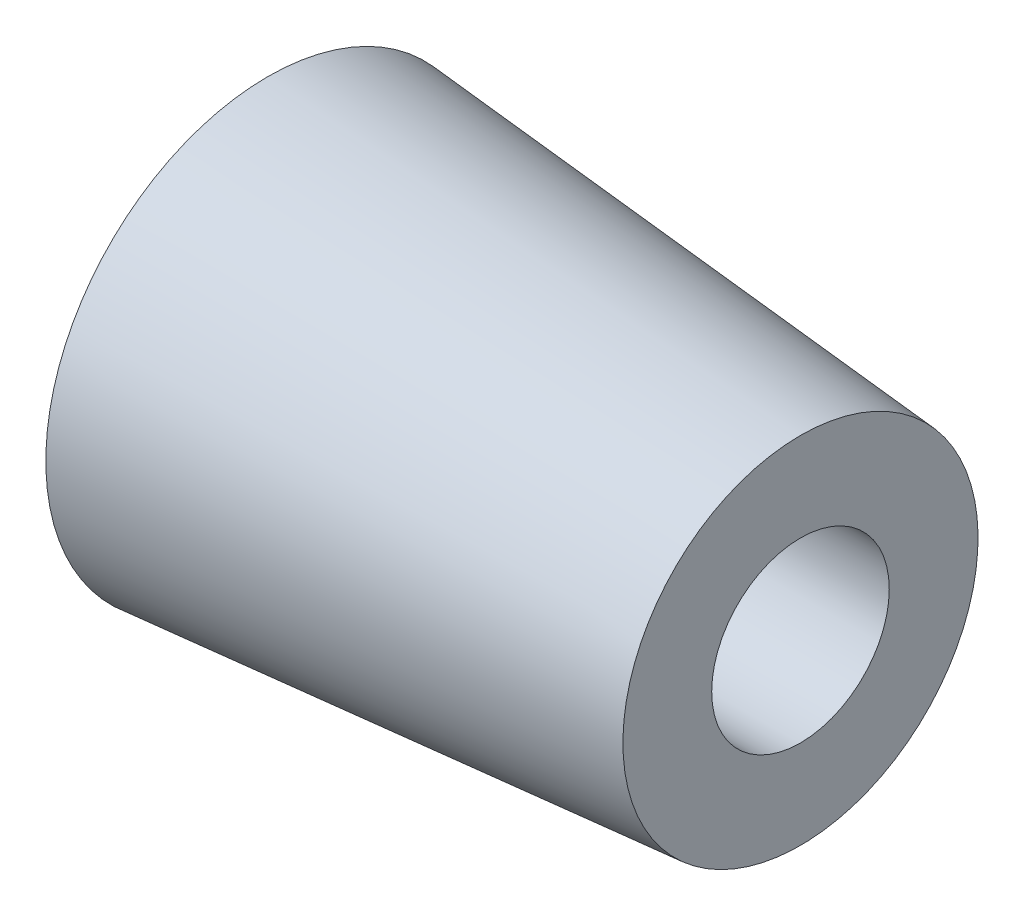
ISO-10303-21;
HEADER;
FILE_DESCRIPTION(('STEP AP214'),'2;1');
FILE_NAME('part.step','',(''),(''),'','','');
FILE_SCHEMA(('AUTOMOTIVE_DESIGN { 1 0 10303 214 1 1 1 1 }'));
ENDSEC;
DATA;
#1=APPLICATION_CONTEXT('core data for automotive mechanical design processes');
#2=APPLICATION_PROTOCOL_DEFINITION('international standard','automotive_design',2000,#1);
#3=PRODUCT_CONTEXT('',#1,'mechanical');
#4=PRODUCT('Part','Part','',(#3));
#5=PRODUCT_RELATED_PRODUCT_CATEGORY('part','',(#4));
#6=PRODUCT_DEFINITION_FORMATION('','',#4);
#7=PRODUCT_DEFINITION_CONTEXT('part definition',#1,'design');
#8=PRODUCT_DEFINITION('design','',#6,#7);
#9=PRODUCT_DEFINITION_SHAPE('','',#8);
#10=(LENGTH_UNIT() NAMED_UNIT(*) SI_UNIT(.MILLI.,.METRE.));
#11=(NAMED_UNIT(*) PLANE_ANGLE_UNIT() SI_UNIT($,.RADIAN.));
#12=(NAMED_UNIT(*) SI_UNIT($,.STERADIAN.) SOLID_ANGLE_UNIT());
#13=UNCERTAINTY_MEASURE_WITH_UNIT(LENGTH_MEASURE(1.E-05),#10,'distance_accuracy_value','');
#14=(GEOMETRIC_REPRESENTATION_CONTEXT(3) GLOBAL_UNCERTAINTY_ASSIGNED_CONTEXT((#13)) GLOBAL_UNIT_ASSIGNED_CONTEXT((#10,
#11,#12)) REPRESENTATION_CONTEXT('',''));
#15=CARTESIAN_POINT('',(0.,0.,0.));
#16=DIRECTION('',(0.,0.,1.));
#17=DIRECTION('',(1.,0.,0.));
#18=AXIS2_PLACEMENT_3D('',#15,#16,#17);
#19=CARTESIAN_POINT('',(0.,0.,0.));
#20=DIRECTION('',(-1.,0.,0.));
#21=DIRECTION('',(0.,-1.,0.));
#22=AXIS2_PLACEMENT_3D('',#19,#20,#21);
#23=PLANE('',#22);
#24=CARTESIAN_POINT('',(0.,0.,0.));
#25=DIRECTION('',(1.,0.,0.));
#26=DIRECTION('',(0.,1.,0.));
#27=AXIS2_PLACEMENT_3D('',#24,#25,#26);
#28=CIRCLE('',#27,2.5);
#29=CARTESIAN_POINT('',(0.,2.5,0.));
#30=VERTEX_POINT('',#29);
#31=EDGE_CURVE('E10',#30,#30,#28,.T.);
#32=ORIENTED_EDGE('',*,*,#31,.F.);
#33=EDGE_LOOP('',(#32));
#34=FACE_BOUND('',#33,.T.);
#35=ADVANCED_FACE('F45',(#34),#23,.T.);
#36=CARTESIAN_POINT('',(6.,0.,0.));
#37=DIRECTION('',(-1.,0.,0.));
#38=DIRECTION('',(0.,-1.,0.));
#39=AXIS2_PLACEMENT_3D('',#36,#37,#38);
#40=CONICAL_SURFACE('',#39,2.,0.0831412318884413);
#41=CARTESIAN_POINT('',(3.6302900335572,-2.17153988797834,-0.336622252254455));
#42=CARTESIAN_POINT('',(3.61171065066113,-2.17626973442894,-0.316215812742302));
#43=CARTESIAN_POINT('',(3.59479454855834,-2.18080062507857,-0.294237309248903));
#44=CARTESIAN_POINT('',(3.5647701473004,-2.18909587381054,-0.247674583678531));
#45=CARTESIAN_POINT('',(3.55166315369669,-2.19285996894597,-0.223089472131822));
#46=CARTESIAN_POINT('',(3.52965911294133,-2.1993031566819,-0.17191840494048));
#47=CARTESIAN_POINT('',(3.52076842738779,-2.20198060887502,-0.145329495551892));
#48=CARTESIAN_POINT('',(3.50754567859207,-2.20599865159785,-0.0909468756274262));
#49=CARTESIAN_POINT('',(3.50321234932978,-2.20733961339522,-0.0631535019232044));
#50=CARTESIAN_POINT('',(3.49932216536154,-2.20854265289097,-0.00800293674296432));
#51=CARTESIAN_POINT('',(3.49963241636339,-2.20844587768327,0.0193440385318699));
#52=CARTESIAN_POINT('',(3.50469456354052,-2.20688244526651,0.0735819376977942));
#53=CARTESIAN_POINT('',(3.50944626548095,-2.20541584796291,0.10047288147983));
#54=CARTESIAN_POINT('',(3.52313995419893,-2.20126704799438,0.152727967793756));
#55=CARTESIAN_POINT('',(3.53203291923467,-2.1985990783317,0.178106155468011));
#56=CARTESIAN_POINT('',(3.55370256708303,-2.19227375599341,0.227011604086022));
#57=CARTESIAN_POINT('',(3.56647979333308,-2.18861626488417,0.250538605454682));
#58=CARTESIAN_POINT('',(3.59598491326627,-2.18047985294387,0.295845207591588));
#59=CARTESIAN_POINT('',(3.61281980105108,-2.17597958595783,0.317551238248277));
#60=CARTESIAN_POINT('',(3.64975849906356,-2.16659191087582,0.35788139104119));
#61=CARTESIAN_POINT('',(3.66986307000105,-2.16170441282445,0.376504793947669));
#62=CARTESIAN_POINT('',(3.71364159064969,-2.15173153969491,0.41085441106986));
#63=CARTESIAN_POINT('',(3.73742067641004,-2.14664558127583,0.426446712731919));
#64=CARTESIAN_POINT('',(3.78733870227248,-2.13686106538299,0.453409157198671));
#65=CARTESIAN_POINT('',(3.81347772161145,-2.13216252092715,0.464779158170253));
#66=CARTESIAN_POINT('',(3.86748628474112,-2.12350234618255,0.482963443030833));
#67=CARTESIAN_POINT('',(3.89535977214383,-2.11954248361674,0.489766897306332));
#68=CARTESIAN_POINT('',(3.95198272064421,-2.11265512212842,0.498512256431369));
#69=CARTESIAN_POINT('',(3.98073198058351,-2.10972738804746,0.500455269291594));
#70=CARTESIAN_POINT('',(4.03734993642025,-2.10513288058374,0.499381624803961));
#71=CARTESIAN_POINT('',(4.06521859930887,-2.10343019124435,0.496515236115723));
#72=CARTESIAN_POINT('',(4.12012897703743,-2.1011515874989,0.486157789862736));
#73=CARTESIAN_POINT('',(4.14717077556666,-2.10057555868624,0.478667201963325));
#74=CARTESIAN_POINT('',(4.19912004252003,-2.10042774212564,0.45946015892225));
#75=CARTESIAN_POINT('',(4.2240584301513,-2.10083696690067,0.447827226806283));
#76=CARTESIAN_POINT('',(4.27167585545932,-2.10240066110929,0.420647020415298));
#77=CARTESIAN_POINT('',(4.2943547248542,-2.1035551860027,0.405099454894269));
#78=CARTESIAN_POINT('',(4.33710007040754,-2.10634162484513,0.370313306000122));
#79=CARTESIAN_POINT('',(4.35713203622202,-2.10797908637251,0.351032778754445));
#80=CARTESIAN_POINT('',(4.39372614833647,-2.11140410540892,0.309430684810656));
#81=CARTESIAN_POINT('',(4.41028798657478,-2.11319167622423,0.287108848409416));
#82=CARTESIAN_POINT('',(4.43972397609894,-2.11663314430717,0.239654709003676));
#83=CARTESIAN_POINT('',(4.45253660480609,-2.11828452285844,0.214484012978555));
#84=CARTESIAN_POINT('',(4.47375431813787,-2.12114506138144,0.162325124488229));
#85=CARTESIAN_POINT('',(4.48215957818943,-2.12235423895354,0.135337004410387));
#86=CARTESIAN_POINT('',(4.49428797123706,-2.12413097319181,0.0804179395477058));
#87=CARTESIAN_POINT('',(4.49802930742256,-2.12470102347469,0.0524910999474383));
#88=CARTESIAN_POINT('',(4.50077475678745,-2.1251174067429,-0.0035989602279714));
#89=CARTESIAN_POINT('',(4.49977914260685,-2.12496378138011,-0.0317621671056195));
#90=CARTESIAN_POINT('',(4.49311361764025,-2.1239620443288,-0.0872505730857144));
#91=CARTESIAN_POINT('',(4.4874870825737,-2.12312037770193,-0.114581117641646));
#92=CARTESIAN_POINT('',(4.47178339768831,-2.12088262076517,-0.167908078093282));
#93=CARTESIAN_POINT('',(4.46170603965491,-2.11948650451779,-0.193904431510487));
#94=CARTESIAN_POINT('',(4.43732661400601,-2.11635450365213,-0.243977183172592));
#95=CARTESIAN_POINT('',(4.4230031102125,-2.11461691050337,-0.268043032715963));
#96=CARTESIAN_POINT('',(4.39054749149573,-2.11109892447439,-0.313451093199194));
#97=CARTESIAN_POINT('',(4.37241508414048,-2.10931852831722,-0.33479309481081));
#98=CARTESIAN_POINT('',(4.33265349557931,-2.10602671294382,-0.374346073107295));
#99=CARTESIAN_POINT('',(4.3109942469107,-2.10451786492645,-0.392527069531906));
#100=CARTESIAN_POINT('',(4.26490072161443,-2.10212115084623,-0.424996621412284));
#101=CARTESIAN_POINT('',(4.24046667034149,-2.10123323439649,-0.439285492645908));
#102=CARTESIAN_POINT('',(4.18976338384751,-2.1003663777155,-0.463433827490182));
#103=CARTESIAN_POINT('',(4.16351341787623,-2.10037902622873,-0.473333410024937));
#104=CARTESIAN_POINT('',(4.10975178242017,-2.1014791364036,-0.488605325223922));
#105=CARTESIAN_POINT('',(4.08224030961264,-2.10256643106045,-0.493978361093302));
#106=CARTESIAN_POINT('',(4.02726250931113,-2.1058496983127,-0.500008240422372));
#107=CARTESIAN_POINT('',(3.9998038136274,-2.10802594047803,-0.500745954312016));
#108=CARTESIAN_POINT('',(3.9452334849836,-2.11340923495292,-0.497742453985779));
#109=CARTESIAN_POINT('',(3.91812190395018,-2.11661643965843,-0.494000577377978));
#110=CARTESIAN_POINT('',(3.86477340035824,-2.12390679819874,-0.482147772077268));
#111=CARTESIAN_POINT('',(3.8385449110002,-2.12799656472084,-0.474003120761822));
#112=CARTESIAN_POINT('',(3.7878598617317,-2.13675890403822,-0.453588710953359));
#113=CARTESIAN_POINT('',(3.76340280186047,-2.14143131137019,-0.441320121940724));
#114=CARTESIAN_POINT('',(3.71978506447669,-2.15041824513967,-0.414785517897119));
#115=CARTESIAN_POINT('',(3.70034522365795,-2.15470377967004,-0.40096536926315));
#116=CARTESIAN_POINT('',(3.66362007723922,-2.163222298516,-0.370695088152822));
#117=CARTESIAN_POINT('',(3.64633484075945,-2.16745528114179,-0.354244871341884));
#118=CARTESIAN_POINT('',(3.6302900335572,-2.17153988797834,-0.336622252254455));
#119=B_SPLINE_CURVE_WITH_KNOTS('',3,(#41,#42,#43,#44,#45,#46,#47,#48,#49,#50,#51,#52,#53,#54,
#55,#56,#57,#58,#59,#60,#61,#62,#63,#64,#65,#66,#67,#68,#69,#70,#71,#72,#73,#74,#75,#76,#77,#78,
#79,#80,#81,#82,#83,#84,#85,#86,#87,#88,#89,#90,#91,#92,#93,#94,#95,#96,#97,#98,#99,#100,#101,
#102,#103,#104,#105,#106,#107,#108,#109,#110,#111,#112,#113,#114,#115,#116,#117,#118),
.UNSPECIFIED.,.T.,.F.,(4,2,2,2,2,2,2,2,2,2,2,2,2,2,2,2,2,2,2,2,2,2,2,2,2,2,2,2,2,2,2,2,2,2,2,2,
2,2,4),(0.,0.0839170564093346,0.16786284110825,0.251934884029065,0.335983565810925,
0.417631580418187,0.499276024537186,0.579977663999121,0.660690599429457,0.743824253275277,
0.82697727636604,0.913230682321277,0.999486985389551,1.08594713018936,1.17238756330251,
1.25617716714183,1.33995826213507,1.42213772110787,1.50432329598302,1.58749238599466,
1.67066885624293,1.75514217063901,1.83961212248031,1.92375134717162,2.00788572920275,
2.09124091280622,2.17459999627349,2.25838729078043,2.34218102048501,2.42673061781062,
2.51127335337123,2.59502656630711,2.67876676566746,2.76104183415289,2.8433290700614,
2.92625569680052,3.00915882673474,3.08162570129187,3.15409490000531),.UNSPECIFIED.);
#120=CARTESIAN_POINT('',(3.6302900335572,-2.17153988797834,-0.336622252254455));
#121=VERTEX_POINT('',#120);
#122=EDGE_CURVE('E68',#121,#121,#119,.T.);
#123=ORIENTED_EDGE('',*,*,#122,.T.);
#124=EDGE_LOOP('',(#123));
#125=FACE_BOUND('',#124,.T.);
#126=ORIENTED_EDGE('',*,*,#31,.T.);
#127=EDGE_LOOP('',(#126));
#128=FACE_BOUND('',#127,.T.);
#129=CARTESIAN_POINT('',(6.,0.,0.));
#130=DIRECTION('',(1.,0.,0.));
#131=DIRECTION('',(0.,1.,0.));
#132=AXIS2_PLACEMENT_3D('',#129,#130,#131);
#133=CIRCLE('',#132,2.);
#134=CARTESIAN_POINT('',(6.,2.,0.));
#135=VERTEX_POINT('',#134);
#136=EDGE_CURVE('E52',#135,#135,#133,.T.);
#137=ORIENTED_EDGE('',*,*,#136,.F.);
#138=EDGE_LOOP('',(#137));
#139=FACE_BOUND('',#138,.T.);
#140=ADVANCED_FACE('F100',(#125,#128,#139),#40,.T.);
#141=CARTESIAN_POINT('',(6.,2.,0.));
#142=DIRECTION('',(1.,0.,0.));
#143=DIRECTION('',(0.,1.,0.));
#144=AXIS2_PLACEMENT_3D('',#141,#142,#143);
#145=PLANE('',#144);
#146=ORIENTED_EDGE('',*,*,#136,.T.);
#147=EDGE_LOOP('',(#146));
#148=FACE_BOUND('',#147,.T.);
#149=CARTESIAN_POINT('',(6.,0.,0.));
#150=DIRECTION('',(1.,0.,0.));
#151=DIRECTION('',(0.,1.,0.));
#152=AXIS2_PLACEMENT_3D('',#149,#150,#151);
#153=CIRCLE('',#152,1.);
#154=CARTESIAN_POINT('',(6.,1.,0.));
#155=VERTEX_POINT('',#154);
#156=EDGE_CURVE('E57',#155,#155,#153,.T.);
#157=ORIENTED_EDGE('',*,*,#156,.F.);
#158=EDGE_LOOP('',(#157));
#159=FACE_BOUND('',#158,.T.);
#160=ADVANCED_FACE('F97',(#148,#159),#145,.T.);
#161=CARTESIAN_POINT('',(2.75,0.,0.));
#162=DIRECTION('',(1.,0.,0.));
#163=DIRECTION('',(0.,1.,0.));
#164=AXIS2_PLACEMENT_3D('',#161,#162,#163);
#165=CYLINDRICAL_SURFACE('',#164,1.);
#166=CARTESIAN_POINT('',(4.,-0.866025403784439,0.5));
#167=CARTESIAN_POINT('',(3.97394609590252,-0.866027673641386,0.499998181537063));
#168=CARTESIAN_POINT('',(3.94785929423752,-0.867219005938538,0.497949985366554));
#169=CARTESIAN_POINT('',(3.89648636766139,-0.871811832260506,0.489861604949081));
#170=CARTESIAN_POINT('',(3.87120204247829,-0.875217970277862,0.483813032277104));
#171=CARTESIAN_POINT('',(3.82227416782804,-0.883746733026927,0.468049974349891));
#172=CARTESIAN_POINT('',(3.79862267376321,-0.888860217366243,0.458354976246861));
#173=CARTESIAN_POINT('',(3.75328789900164,-0.900213324084306,0.43563376268819));
#174=CARTESIAN_POINT('',(3.73160472486877,-0.906453007380327,0.422607367017887));
#175=CARTESIAN_POINT('',(3.68884713572125,-0.919984345287201,0.392333270265438));
#176=CARTESIAN_POINT('',(3.66797043216323,-0.927320318189766,0.374826018071885));
#177=CARTESIAN_POINT('',(3.62929580579665,-0.94185991392853,0.336626903807234));
#178=CARTESIAN_POINT('',(3.61149941870824,-0.94906346915625,0.315933462891146));
#179=CARTESIAN_POINT('',(3.57831642442617,-0.963107384764744,0.270244781707273));
#180=CARTESIAN_POINT('',(3.56317311607024,-0.969890532090862,0.245053594506287));
#181=CARTESIAN_POINT('',(3.53742957337712,-0.981753780497645,0.192078513299752));
#182=CARTESIAN_POINT('',(3.52682647193141,-0.986834955918708,0.164296269069077));
#183=CARTESIAN_POINT('',(3.51124766934945,-0.994402306221187,0.109022471962988));
#184=CARTESIAN_POINT('',(3.50592523682223,-0.99704740110446,0.0816508952444084));
#185=CARTESIAN_POINT('',(3.49991694066248,-1.00003791923034,0.0262853143489239));
#186=CARTESIAN_POINT('',(3.49922827160215,-1.00038473392295,-0.00170830292186942));
#187=CARTESIAN_POINT('',(3.50237333698517,-0.99881490958225,-0.0549162622118751));
#188=CARTESIAN_POINT('',(3.50581900776061,-0.997092479460802,-0.0801605995883958));
#189=CARTESIAN_POINT('',(3.51644042195233,-0.991871226298737,-0.129656885959161));
#190=CARTESIAN_POINT('',(3.52361644448811,-0.988372270331969,-0.153908760546963));
#191=CARTESIAN_POINT('',(3.54154128304491,-0.979857916438272,-0.201154695784777));
#192=CARTESIAN_POINT('',(3.55233815658603,-0.974822207645995,-0.224126711757589));
#193=CARTESIAN_POINT('',(3.57713170810075,-0.963688229933435,-0.267988400756664));
#194=CARTESIAN_POINT('',(3.59112953165118,-0.95758958078742,-0.288877324419323));
#195=CARTESIAN_POINT('',(3.62344767576651,-0.944221971996145,-0.330086830449097));
#196=CARTESIAN_POINT('',(3.64205151416301,-0.936896879990875,-0.35016703751468));
#197=CARTESIAN_POINT('',(3.68229486246509,-0.922271702934058,-0.38705218514889));
#198=CARTESIAN_POINT('',(3.70393668613703,-0.914971641328144,-0.403854605787115));
#199=CARTESIAN_POINT('',(3.75132409621204,-0.900720780462423,-0.434752667321106));
#200=CARTESIAN_POINT('',(3.77724301152711,-0.893821599953537,-0.448608657489026));
#201=CARTESIAN_POINT('',(3.8314688356795,-0.881877251392879,-0.471659556500616));
#202=CARTESIAN_POINT('',(3.85977321650878,-0.876830150230337,-0.480859329105445));
#203=CARTESIAN_POINT('',(3.91560725564139,-0.869723179085172,-0.49359010551252));
#204=CARTESIAN_POINT('',(3.94302055952178,-0.867458279242482,-0.497512561059988));
#205=CARTESIAN_POINT('',(3.99820067075827,-0.865589596808047,-0.500758473305713));
#206=CARTESIAN_POINT('',(4.02596721455989,-0.865983934446558,-0.500085178657513));
#207=CARTESIAN_POINT('',(4.07782695928936,-0.869171682702924,-0.494518021671983));
#208=CARTESIAN_POINT('',(4.10198972555396,-0.87169793753327,-0.490093908356233));
#209=CARTESIAN_POINT('',(4.14918389313548,-0.878470107756705,-0.47784814231622));
#210=CARTESIAN_POINT('',(4.1722149253733,-0.882716580025169,-0.470025389311807));
#211=CARTESIAN_POINT('',(4.21770566545135,-0.892681110398283,-0.450823794302443));
#212=CARTESIAN_POINT('',(4.24008950842678,-0.898458216215316,-0.439297031846361));
#213=CARTESIAN_POINT('',(4.2827346357695,-0.910780597486248,-0.413143532007902));
#214=CARTESIAN_POINT('',(4.30299482175664,-0.917326266775737,-0.398515202166108));
#215=CARTESIAN_POINT('',(4.34348938376178,-0.93143999228168,-0.364418583599426));
#216=CARTESIAN_POINT('',(4.36339857535883,-0.939032915771447,-0.344572636157482));
#217=CARTESIAN_POINT('',(4.3997061189968,-0.95367117488946,-0.301702247699144));
#218=CARTESIAN_POINT('',(4.41610328511527,-0.960716325038539,-0.278676737327674));
#219=CARTESIAN_POINT('',(4.44528686297505,-0.973706808454791,-0.229267681279377));
#220=CARTESIAN_POINT('',(4.45796655910545,-0.979618208360172,-0.20281154878705));
#221=CARTESIAN_POINT('',(4.4785689519287,-0.989416774796478,-0.147761182320547));
#222=CARTESIAN_POINT('',(4.48649582568317,-0.993305718381767,-0.11916885069611));
#223=CARTESIAN_POINT('',(4.49668428208732,-0.998337540909502,-0.0634898411651882));
#224=CARTESIAN_POINT('',(4.49939893793801,-0.999699639541274,-0.0365057219251567));
#225=CARTESIAN_POINT('',(4.50042163272725,-1.00021065187534,0.0175629929755307));
#226=CARTESIAN_POINT('',(4.49873121426197,-0.999360340333266,0.044647550147278));
#227=CARTESIAN_POINT('',(4.49129179660201,-0.995669844190718,0.0962689961588216));
#228=CARTESIAN_POINT('',(4.48581757537054,-0.992964473343948,0.120856158906529));
#229=CARTESIAN_POINT('',(4.47133650034914,-0.985960468313116,0.168722976090912));
#230=CARTESIAN_POINT('',(4.4623291399556,-0.981661605649085,0.192002442474414));
#231=CARTESIAN_POINT('',(4.44063647391459,-0.97162965375613,0.237711703125926));
#232=CARTESIAN_POINT('',(4.42781033838687,-0.965843086053095,0.260062571363279));
#233=CARTESIAN_POINT('',(4.39902103457969,-0.953440665650003,0.30238732089375));
#234=CARTESIAN_POINT('',(4.38305642547661,-0.946824432570784,0.322360103657878));
#235=CARTESIAN_POINT('',(4.34660143045036,-0.932643051375992,0.361457002133393));
#236=CARTESIAN_POINT('',(4.32581875611261,-0.925048996007108,0.380298842483295));
#237=CARTESIAN_POINT('',(4.28127463928444,-0.910315381771854,0.414331643912887));
#238=CARTESIAN_POINT('',(4.25751058952454,-0.903176229068854,0.429519375063787));
#239=CARTESIAN_POINT('',(4.20668167675085,-0.889998026256437,0.456215539833051));
#240=CARTESIAN_POINT('',(4.17953623444634,-0.884000871211844,0.467592532964975));
#241=CARTESIAN_POINT('',(4.12333379781943,-0.874330781711029,0.485439354768648));
#242=CARTESIAN_POINT('',(4.09428355554207,-0.870650080748793,0.491925595589966));
#243=CARTESIAN_POINT('',(4.05409732217458,-0.867646363005208,0.497183503931372));
#244=CARTESIAN_POINT('',(4.04331605280122,-0.867040645024727,0.498238052481695));
#245=CARTESIAN_POINT('',(4.02169175965872,-0.866229679439781,0.499646702545211));
#246=CARTESIAN_POINT('',(4.010848731807,-0.866024458625925,0.50000075720002));
#247=CARTESIAN_POINT('',(4.,-0.866025403784439,0.5));
#248=B_SPLINE_CURVE_WITH_KNOTS('',3,(#166,#167,#168,#169,#170,#171,#172,#173,#174,#175,#176,
#177,#178,#179,#180,#181,#182,#183,#184,#185,#186,#187,#188,#189,#190,#191,#192,#193,#194,#195,
#196,#197,#198,#199,#200,#201,#202,#203,#204,#205,#206,#207,#208,#209,#210,#211,#212,#213,#214,
#215,#216,#217,#218,#219,#220,#221,#222,#223,#224,#225,#226,#227,#228,#229,#230,#231,#232,#233,
#234,#235,#236,#237,#238,#239,#240,#241,#242,#243,#244,#245,#246,#247),.UNSPECIFIED.,.T.,.F.,(4,
2,2,2,2,2,2,2,2,2,2,2,2,2,2,2,2,2,2,2,2,2,2,2,2,2,2,2,2,2,2,2,2,2,2,2,2,2,2,2,4),(0.,
0.0781160612973575,0.156396446412402,0.234264297959443,0.312136362722575,0.396431156249117,
0.480767855421855,0.570789461193817,0.660754134819455,0.744317424839676,0.8278301184302,
0.904080487422691,0.980336562587275,1.05764767365573,1.13498649675136,1.21963595728445,
1.30435024122959,1.39444420864724,1.48444387105852,1.56731145427106,1.65012046594186,
1.72387091712013,1.79764526218031,1.87483648203044,1.95206743110024,2.03903371790307,
2.12602932489101,2.21532090706483,2.30453389904386,2.38556135194743,2.46656043396986,
2.54222212435746,2.61789466756006,2.69680375359736,2.77574915050359,2.8625512092522,
2.94942971422225,3.03905374518951,3.12837566501028,3.16090067592303,3.19342786246919),.UNSPECIFIED.);
#249=CARTESIAN_POINT('',(4.,-0.866025403784439,0.5));
#250=VERTEX_POINT('',#249);
#251=EDGE_CURVE('E77',#250,#250,#248,.T.);
#252=ORIENTED_EDGE('',*,*,#251,.T.);
#253=EDGE_LOOP('',(#252));
#254=FACE_BOUND('',#253,.T.);
#255=ORIENTED_EDGE('',*,*,#156,.T.);
#256=EDGE_LOOP('',(#255));
#257=FACE_BOUND('',#256,.T.);
#258=CARTESIAN_POINT('',(2.75,0.,0.));
#259=DIRECTION('',(1.,0.,0.));
#260=DIRECTION('',(0.,1.,0.));
#261=AXIS2_PLACEMENT_3D('',#258,#259,#260);
#262=CIRCLE('',#261,1.);
#263=CARTESIAN_POINT('',(2.75,1.,0.));
#264=VERTEX_POINT('',#263);
#265=EDGE_CURVE('E62',#264,#264,#262,.T.);
#266=ORIENTED_EDGE('',*,*,#265,.F.);
#267=EDGE_LOOP('',(#266));
#268=FACE_BOUND('',#267,.T.);
#269=ADVANCED_FACE('F93',(#254,#257,#268),#165,.F.);
#270=CARTESIAN_POINT('',(2.75,1.,0.));
#271=DIRECTION('',(1.,0.,0.));
#272=DIRECTION('',(0.,1.,0.));
#273=AXIS2_PLACEMENT_3D('',#270,#271,#272);
#274=PLANE('',#273);
#275=ORIENTED_EDGE('',*,*,#265,.T.);
#276=EDGE_LOOP('',(#275));
#277=FACE_BOUND('',#276,.T.);
#278=ADVANCED_FACE('F88',(#277),#274,.T.);
#279=CARTESIAN_POINT('',(4.,-2.501,0.));
#280=DIRECTION('',(0.,1.,0.));
#281=DIRECTION('',(0.,0.,1.));
#282=AXIS2_PLACEMENT_3D('',#279,#280,#281);
#283=CYLINDRICAL_SURFACE('',#282,0.5);
#284=ORIENTED_EDGE('',*,*,#122,.F.);
#285=EDGE_LOOP('',(#284));
#286=FACE_BOUND('',#285,.T.);
#287=ORIENTED_EDGE('',*,*,#251,.F.);
#288=EDGE_LOOP('',(#287));
#289=FACE_BOUND('',#288,.T.);
#290=ADVANCED_FACE('F82',(#286,#289),#283,.F.);
#291=CLOSED_SHELL('',(#35,#140,#160,#269,#278,#290));
#292=MANIFOLD_SOLID_BREP('B2',#291);
#293=ADVANCED_BREP_SHAPE_REPRESENTATION('',(#18,#292),#14);
#294=SHAPE_DEFINITION_REPRESENTATION(#9,#293);
ENDSEC;
END-ISO-10303-21;
